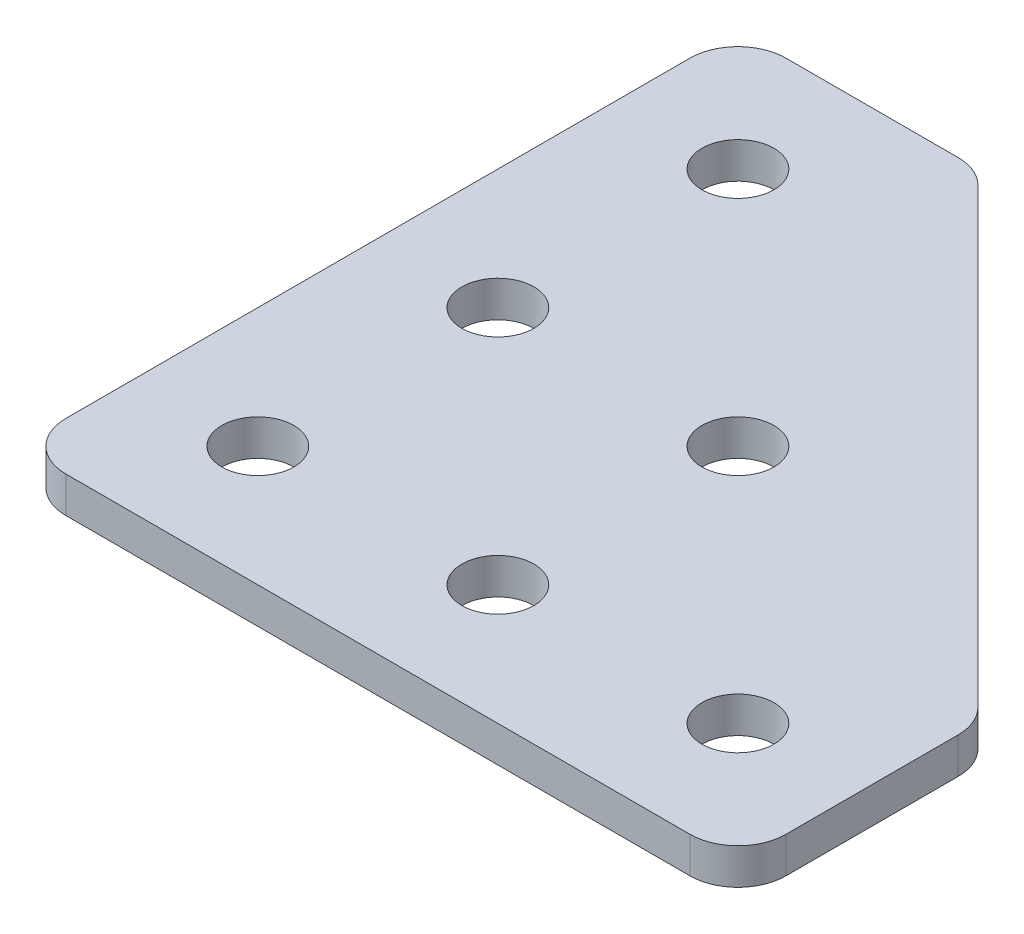
ISO-10303-21;
HEADER;
FILE_DESCRIPTION(('STEP AP214'),'2;1');
FILE_NAME('part.step','',(''),(''),'','','');
FILE_SCHEMA(('AUTOMOTIVE_DESIGN { 1 0 10303 214 1 1 1 1 }'));
ENDSEC;
DATA;
#1=APPLICATION_CONTEXT('core data for automotive mechanical design processes');
#2=APPLICATION_PROTOCOL_DEFINITION('international standard','automotive_design',2000,#1);
#3=PRODUCT_CONTEXT('',#1,'mechanical');
#4=PRODUCT('Part','Part','',(#3));
#5=PRODUCT_RELATED_PRODUCT_CATEGORY('part','',(#4));
#6=PRODUCT_DEFINITION_FORMATION('','',#4);
#7=PRODUCT_DEFINITION_CONTEXT('part definition',#1,'design');
#8=PRODUCT_DEFINITION('design','',#6,#7);
#9=PRODUCT_DEFINITION_SHAPE('','',#8);
#10=(LENGTH_UNIT() NAMED_UNIT(*) SI_UNIT(.MILLI.,.METRE.));
#11=(NAMED_UNIT(*) PLANE_ANGLE_UNIT() SI_UNIT($,.RADIAN.));
#12=(NAMED_UNIT(*) SI_UNIT($,.STERADIAN.) SOLID_ANGLE_UNIT());
#13=UNCERTAINTY_MEASURE_WITH_UNIT(LENGTH_MEASURE(1.E-05),#10,'distance_accuracy_value','');
#14=(GEOMETRIC_REPRESENTATION_CONTEXT(3) GLOBAL_UNCERTAINTY_ASSIGNED_CONTEXT((#13)) GLOBAL_UNIT_ASSIGNED_CONTEXT((#10,
#11,#12)) REPRESENTATION_CONTEXT('',''));
#15=CARTESIAN_POINT('',(0.,0.,0.));
#16=DIRECTION('',(0.,0.,1.));
#17=DIRECTION('',(1.,0.,0.));
#18=AXIS2_PLACEMENT_3D('',#15,#16,#17);
#19=CARTESIAN_POINT('',(0.,1.5,0.));
#20=DIRECTION('',(0.,1.,0.));
#21=DIRECTION('',(0.,0.,1.));
#22=AXIS2_PLACEMENT_3D('',#19,#20,#21);
#23=PLANE('',#22);
#24=CARTESIAN_POINT('',(15.,1.5,-15.));
#25=DIRECTION('',(0.,1.,0.));
#26=DIRECTION('',(0.,0.,1.));
#27=AXIS2_PLACEMENT_3D('',#24,#25,#26);
#28=CIRCLE('',#27,1.5);
#29=CARTESIAN_POINT('',(15.,1.5,-13.5));
#30=VERTEX_POINT('',#29);
#31=EDGE_CURVE('E228',#30,#30,#28,.T.);
#32=ORIENTED_EDGE('',*,*,#31,.F.);
#33=EDGE_LOOP('',(#32));
#34=FACE_BOUND('',#33,.T.);
#35=CARTESIAN_POINT('',(5.,1.5,-25.));
#36=DIRECTION('',(0.,1.,0.));
#37=DIRECTION('',(0.,0.,-1.));
#38=AXIS2_PLACEMENT_3D('',#35,#36,#37);
#39=CIRCLE('',#38,1.5);
#40=CARTESIAN_POINT('',(5.,1.5,-26.5));
#41=VERTEX_POINT('',#40);
#42=EDGE_CURVE('E216',#41,#41,#39,.T.);
#43=ORIENTED_EDGE('',*,*,#42,.F.);
#44=EDGE_LOOP('',(#43));
#45=FACE_BOUND('',#44,.T.);
#46=CARTESIAN_POINT('',(5.,1.5,-5.));
#47=DIRECTION('',(0.,1.,0.));
#48=DIRECTION('',(0.,0.,1.));
#49=AXIS2_PLACEMENT_3D('',#46,#47,#48);
#50=CIRCLE('',#49,1.5);
#51=CARTESIAN_POINT('',(5.,1.5,-3.5));
#52=VERTEX_POINT('',#51);
#53=EDGE_CURVE('E146',#52,#52,#50,.T.);
#54=ORIENTED_EDGE('',*,*,#53,.F.);
#55=EDGE_LOOP('',(#54));
#56=FACE_BOUND('',#55,.T.);
#57=DIRECTION('',(0.,0.,1.));
#58=VECTOR('',#57,1.);
#59=CARTESIAN_POINT('',(0.,1.5,-30.));
#60=LINE('',#59,#58);
#61=CARTESIAN_POINT('',(0.,1.5,-28.));
#62=VERTEX_POINT('',#61);
#63=CARTESIAN_POINT('',(0.,1.5,-2.00000000000001));
#64=VERTEX_POINT('',#63);
#65=EDGE_CURVE('E154',#62,#64,#60,.T.);
#66=ORIENTED_EDGE('',*,*,#65,.T.);
#67=CARTESIAN_POINT('',(2.,1.5,-2.));
#68=DIRECTION('',(0.,1.,0.));
#69=DIRECTION('',(0.,0.,1.));
#70=AXIS2_PLACEMENT_3D('',#67,#68,#69);
#71=CIRCLE('',#70,2.);
#72=CARTESIAN_POINT('',(2.,1.5,0.));
#73=VERTEX_POINT('',#72);
#74=EDGE_CURVE('E173',#64,#73,#71,.T.);
#75=ORIENTED_EDGE('',*,*,#74,.T.);
#76=DIRECTION('',(1.,0.,0.));
#77=VECTOR('',#76,1.);
#78=CARTESIAN_POINT('',(0.,1.5,0.));
#79=LINE('',#78,#77);
#80=CARTESIAN_POINT('',(28.,1.5,0.));
#81=VERTEX_POINT('',#80);
#82=EDGE_CURVE('E133',#73,#81,#79,.T.);
#83=ORIENTED_EDGE('',*,*,#82,.T.);
#84=CARTESIAN_POINT('',(28.,1.5,-2.));
#85=DIRECTION('',(0.,1.,0.));
#86=DIRECTION('',(0.,0.,1.));
#87=AXIS2_PLACEMENT_3D('',#84,#85,#86);
#88=CIRCLE('',#87,2.);
#89=CARTESIAN_POINT('',(30.,1.5,-2.));
#90=VERTEX_POINT('',#89);
#91=EDGE_CURVE('E171',#81,#90,#88,.T.);
#92=ORIENTED_EDGE('',*,*,#91,.T.);
#93=DIRECTION('',(0.,0.,-1.));
#94=VECTOR('',#93,1.);
#95=CARTESIAN_POINT('',(30.,1.5,0.));
#96=LINE('',#95,#94);
#97=CARTESIAN_POINT('',(30.,1.5,-9.17157287525381));
#98=VERTEX_POINT('',#97);
#99=EDGE_CURVE('E199',#90,#98,#96,.T.);
#100=ORIENTED_EDGE('',*,*,#99,.T.);
#101=CARTESIAN_POINT('',(28.,1.5,-9.17157287525381));
#102=DIRECTION('',(0.,1.,0.));
#103=DIRECTION('',(0.,0.,1.));
#104=AXIS2_PLACEMENT_3D('',#101,#102,#103);
#105=CIRCLE('',#104,2.);
#106=CARTESIAN_POINT('',(29.4142135623731,1.5,-10.5857864376269));
#107=VERTEX_POINT('',#106);
#108=EDGE_CURVE('E169',#98,#107,#105,.T.);
#109=ORIENTED_EDGE('',*,*,#108,.T.);
#110=DIRECTION('',(-0.707106781186548,0.,-0.707106781186548));
#111=VECTOR('',#110,1.);
#112=CARTESIAN_POINT('',(30.,1.5,-10.));
#113=LINE('',#112,#111);
#114=CARTESIAN_POINT('',(10.5857864376269,1.5,-29.4142135623731));
#115=VERTEX_POINT('',#114);
#116=EDGE_CURVE('E190',#107,#115,#113,.T.);
#117=ORIENTED_EDGE('',*,*,#116,.T.);
#118=CARTESIAN_POINT('',(9.17157287525381,1.5,-28.));
#119=DIRECTION('',(0.,1.,0.));
#120=DIRECTION('',(0.,0.,1.));
#121=AXIS2_PLACEMENT_3D('',#118,#119,#120);
#122=CIRCLE('',#121,2.);
#123=CARTESIAN_POINT('',(9.17157287525381,1.5,-30.));
#124=VERTEX_POINT('',#123);
#125=EDGE_CURVE('E56',#115,#124,#122,.T.);
#126=ORIENTED_EDGE('',*,*,#125,.T.);
#127=DIRECTION('',(-1.,0.,0.));
#128=VECTOR('',#127,1.);
#129=CARTESIAN_POINT('',(10.,1.5,-30.));
#130=LINE('',#129,#128);
#131=CARTESIAN_POINT('',(2.,1.5,-30.));
#132=VERTEX_POINT('',#131);
#133=EDGE_CURVE('E155',#124,#132,#130,.T.);
#134=ORIENTED_EDGE('',*,*,#133,.T.);
#135=CARTESIAN_POINT('',(2.,1.5,-28.));
#136=DIRECTION('',(0.,1.,0.));
#137=DIRECTION('',(0.,0.,1.));
#138=AXIS2_PLACEMENT_3D('',#135,#136,#137);
#139=CIRCLE('',#138,2.);
#140=EDGE_CURVE('E166',#132,#62,#139,.T.);
#141=ORIENTED_EDGE('',*,*,#140,.T.);
#142=EDGE_LOOP('',(#66,#75,#83,#92,#100,#109,#117,#126,#134,#141));
#143=FACE_BOUND('',#142,.T.);
#144=CARTESIAN_POINT('',(25.,1.5,-5.));
#145=DIRECTION('',(0.,1.,0.));
#146=DIRECTION('',(0.,0.,1.));
#147=AXIS2_PLACEMENT_3D('',#144,#145,#146);
#148=CIRCLE('',#147,1.5);
#149=CARTESIAN_POINT('',(25.,1.5,-3.5));
#150=VERTEX_POINT('',#149);
#151=EDGE_CURVE('E210',#150,#150,#148,.T.);
#152=ORIENTED_EDGE('',*,*,#151,.F.);
#153=EDGE_LOOP('',(#152));
#154=FACE_BOUND('',#153,.T.);
#155=CARTESIAN_POINT('',(5.,1.5,-15.));
#156=DIRECTION('',(0.,1.,0.));
#157=DIRECTION('',(0.,0.,1.));
#158=AXIS2_PLACEMENT_3D('',#155,#156,#157);
#159=CIRCLE('',#158,1.5);
#160=CARTESIAN_POINT('',(5.,1.5,-13.5));
#161=VERTEX_POINT('',#160);
#162=EDGE_CURVE('E222',#161,#161,#159,.T.);
#163=ORIENTED_EDGE('',*,*,#162,.F.);
#164=EDGE_LOOP('',(#163));
#165=FACE_BOUND('',#164,.T.);
#166=CARTESIAN_POINT('',(15.,1.5,-5.));
#167=DIRECTION('',(0.,1.,0.));
#168=DIRECTION('',(0.,0.,1.));
#169=AXIS2_PLACEMENT_3D('',#166,#167,#168);
#170=CIRCLE('',#169,1.5);
#171=CARTESIAN_POINT('',(15.,1.5,-3.5));
#172=VERTEX_POINT('',#171);
#173=EDGE_CURVE('E234',#172,#172,#170,.T.);
#174=ORIENTED_EDGE('',*,*,#173,.F.);
#175=EDGE_LOOP('',(#174));
#176=FACE_BOUND('',#175,.T.);
#177=ADVANCED_FACE('F35',(#34,#45,#56,#143,#154,#165,#176),#23,.T.);
#178=CARTESIAN_POINT('',(0.,0.,0.));
#179=DIRECTION('',(0.,1.,0.));
#180=DIRECTION('',(0.,0.,1.));
#181=AXIS2_PLACEMENT_3D('',#178,#179,#180);
#182=PLANE('',#181);
#183=DIRECTION('',(1.,0.,0.));
#184=VECTOR('',#183,1.);
#185=CARTESIAN_POINT('',(0.,0.,0.));
#186=LINE('',#185,#184);
#187=CARTESIAN_POINT('',(2.,0.,0.));
#188=VERTEX_POINT('',#187);
#189=CARTESIAN_POINT('',(28.,0.,0.));
#190=VERTEX_POINT('',#189);
#191=EDGE_CURVE('E130',#188,#190,#186,.T.);
#192=ORIENTED_EDGE('',*,*,#191,.F.);
#193=CARTESIAN_POINT('',(2.,0.,-2.));
#194=DIRECTION('',(0.,1.,0.));
#195=DIRECTION('',(0.,0.,1.));
#196=AXIS2_PLACEMENT_3D('',#193,#194,#195);
#197=CIRCLE('',#196,2.);
#198=CARTESIAN_POINT('',(0.,0.,-2.00000000000001));
#199=VERTEX_POINT('',#198);
#200=EDGE_CURVE('E113',#188,#199,#197,.F.);
#201=ORIENTED_EDGE('',*,*,#200,.T.);
#202=DIRECTION('',(0.,0.,1.));
#203=VECTOR('',#202,1.);
#204=CARTESIAN_POINT('',(0.,0.,-30.));
#205=LINE('',#204,#203);
#206=CARTESIAN_POINT('',(0.,0.,-28.));
#207=VERTEX_POINT('',#206);
#208=EDGE_CURVE('E141',#207,#199,#205,.T.);
#209=ORIENTED_EDGE('',*,*,#208,.F.);
#210=CARTESIAN_POINT('',(2.,0.,-28.));
#211=DIRECTION('',(0.,1.,0.));
#212=DIRECTION('',(0.,0.,1.));
#213=AXIS2_PLACEMENT_3D('',#210,#211,#212);
#214=CIRCLE('',#213,2.);
#215=CARTESIAN_POINT('',(2.,0.,-30.));
#216=VERTEX_POINT('',#215);
#217=EDGE_CURVE('E134',#207,#216,#214,.F.);
#218=ORIENTED_EDGE('',*,*,#217,.T.);
#219=DIRECTION('',(-1.,0.,0.));
#220=VECTOR('',#219,1.);
#221=CARTESIAN_POINT('',(10.,0.,-30.));
#222=LINE('',#221,#220);
#223=CARTESIAN_POINT('',(9.17157287525381,0.,-30.));
#224=VERTEX_POINT('',#223);
#225=EDGE_CURVE('E152',#224,#216,#222,.T.);
#226=ORIENTED_EDGE('',*,*,#225,.F.);
#227=CARTESIAN_POINT('',(9.17157287525381,0.,-28.));
#228=DIRECTION('',(0.,1.,0.));
#229=DIRECTION('',(0.,0.,1.));
#230=AXIS2_PLACEMENT_3D('',#227,#228,#229);
#231=CIRCLE('',#230,2.);
#232=CARTESIAN_POINT('',(10.5857864376269,0.,-29.4142135623731));
#233=VERTEX_POINT('',#232);
#234=EDGE_CURVE('E158',#224,#233,#231,.F.);
#235=ORIENTED_EDGE('',*,*,#234,.T.);
#236=DIRECTION('',(-0.707106781186548,0.,-0.707106781186548));
#237=VECTOR('',#236,1.);
#238=CARTESIAN_POINT('',(30.,0.,-10.));
#239=LINE('',#238,#237);
#240=CARTESIAN_POINT('',(29.4142135623731,0.,-10.5857864376269));
#241=VERTEX_POINT('',#240);
#242=EDGE_CURVE('E144',#241,#233,#239,.T.);
#243=ORIENTED_EDGE('',*,*,#242,.F.);
#244=CARTESIAN_POINT('',(28.,0.,-9.17157287525381));
#245=DIRECTION('',(0.,1.,0.));
#246=DIRECTION('',(0.,0.,1.));
#247=AXIS2_PLACEMENT_3D('',#244,#245,#246);
#248=CIRCLE('',#247,2.);
#249=CARTESIAN_POINT('',(30.,0.,-9.17157287525381));
#250=VERTEX_POINT('',#249);
#251=EDGE_CURVE('E160',#241,#250,#248,.F.);
#252=ORIENTED_EDGE('',*,*,#251,.T.);
#253=DIRECTION('',(0.,0.,-1.));
#254=VECTOR('',#253,1.);
#255=CARTESIAN_POINT('',(30.,0.,0.));
#256=LINE('',#255,#254);
#257=CARTESIAN_POINT('',(30.,0.,-2.));
#258=VERTEX_POINT('',#257);
#259=EDGE_CURVE('E140',#258,#250,#256,.T.);
#260=ORIENTED_EDGE('',*,*,#259,.F.);
#261=CARTESIAN_POINT('',(28.,0.,-2.));
#262=DIRECTION('',(0.,1.,0.));
#263=DIRECTION('',(0.,0.,1.));
#264=AXIS2_PLACEMENT_3D('',#261,#262,#263);
#265=CIRCLE('',#264,2.);
#266=EDGE_CURVE('E124',#258,#190,#265,.F.);
#267=ORIENTED_EDGE('',*,*,#266,.T.);
#268=EDGE_LOOP('',(#192,#201,#209,#218,#226,#235,#243,#252,#260,#267));
#269=FACE_BOUND('',#268,.T.);
#270=CARTESIAN_POINT('',(5.,0.,-5.));
#271=DIRECTION('',(0.,1.,0.));
#272=DIRECTION('',(0.,0.,1.));
#273=AXIS2_PLACEMENT_3D('',#270,#271,#272);
#274=CIRCLE('',#273,1.5);
#275=CARTESIAN_POINT('',(5.,0.,-3.5));
#276=VERTEX_POINT('',#275);
#277=EDGE_CURVE('E207',#276,#276,#274,.T.);
#278=ORIENTED_EDGE('',*,*,#277,.T.);
#279=EDGE_LOOP('',(#278));
#280=FACE_BOUND('',#279,.T.);
#281=CARTESIAN_POINT('',(25.,0.,-5.));
#282=DIRECTION('',(0.,1.,0.));
#283=DIRECTION('',(0.,0.,1.));
#284=AXIS2_PLACEMENT_3D('',#281,#282,#283);
#285=CIRCLE('',#284,1.5);
#286=CARTESIAN_POINT('',(25.,0.,-3.5));
#287=VERTEX_POINT('',#286);
#288=EDGE_CURVE('E213',#287,#287,#285,.T.);
#289=ORIENTED_EDGE('',*,*,#288,.T.);
#290=EDGE_LOOP('',(#289));
#291=FACE_BOUND('',#290,.T.);
#292=CARTESIAN_POINT('',(5.,0.,-25.));
#293=DIRECTION('',(0.,1.,0.));
#294=DIRECTION('',(0.,0.,-1.));
#295=AXIS2_PLACEMENT_3D('',#292,#293,#294);
#296=CIRCLE('',#295,1.5);
#297=CARTESIAN_POINT('',(5.,0.,-26.5));
#298=VERTEX_POINT('',#297);
#299=EDGE_CURVE('E219',#298,#298,#296,.T.);
#300=ORIENTED_EDGE('',*,*,#299,.T.);
#301=EDGE_LOOP('',(#300));
#302=FACE_BOUND('',#301,.T.);
#303=CARTESIAN_POINT('',(5.,0.,-15.));
#304=DIRECTION('',(0.,1.,0.));
#305=DIRECTION('',(0.,0.,1.));
#306=AXIS2_PLACEMENT_3D('',#303,#304,#305);
#307=CIRCLE('',#306,1.5);
#308=CARTESIAN_POINT('',(5.,0.,-13.5));
#309=VERTEX_POINT('',#308);
#310=EDGE_CURVE('E225',#309,#309,#307,.T.);
#311=ORIENTED_EDGE('',*,*,#310,.T.);
#312=EDGE_LOOP('',(#311));
#313=FACE_BOUND('',#312,.T.);
#314=CARTESIAN_POINT('',(15.,0.,-15.));
#315=DIRECTION('',(0.,1.,0.));
#316=DIRECTION('',(0.,0.,1.));
#317=AXIS2_PLACEMENT_3D('',#314,#315,#316);
#318=CIRCLE('',#317,1.5);
#319=CARTESIAN_POINT('',(15.,0.,-13.5));
#320=VERTEX_POINT('',#319);
#321=EDGE_CURVE('E231',#320,#320,#318,.T.);
#322=ORIENTED_EDGE('',*,*,#321,.T.);
#323=EDGE_LOOP('',(#322));
#324=FACE_BOUND('',#323,.T.);
#325=CARTESIAN_POINT('',(15.,0.,-5.));
#326=DIRECTION('',(0.,1.,0.));
#327=DIRECTION('',(0.,0.,1.));
#328=AXIS2_PLACEMENT_3D('',#325,#326,#327);
#329=CIRCLE('',#328,1.5);
#330=CARTESIAN_POINT('',(15.,0.,-3.5));
#331=VERTEX_POINT('',#330);
#332=EDGE_CURVE('E237',#331,#331,#329,.T.);
#333=ORIENTED_EDGE('',*,*,#332,.T.);
#334=EDGE_LOOP('',(#333));
#335=FACE_BOUND('',#334,.T.);
#336=ADVANCED_FACE('F137',(#269,#280,#291,#302,#313,#324,#335),#182,.F.);
#337=CARTESIAN_POINT('',(0.,1.5,-30.));
#338=DIRECTION('',(1.,0.,0.));
#339=DIRECTION('',(0.,0.,-1.));
#340=AXIS2_PLACEMENT_3D('',#337,#338,#339);
#341=PLANE('',#340);
#342=ORIENTED_EDGE('',*,*,#208,.T.);
#343=DIRECTION('',(0.,-1.,0.));
#344=VECTOR('',#343,1.);
#345=CARTESIAN_POINT('',(0.,1.5,-2.));
#346=LINE('',#345,#344);
#347=EDGE_CURVE('E118',#199,#64,#346,.F.);
#348=ORIENTED_EDGE('',*,*,#347,.T.);
#349=ORIENTED_EDGE('',*,*,#65,.F.);
#350=DIRECTION('',(0.,-1.,0.));
#351=VECTOR('',#350,1.);
#352=CARTESIAN_POINT('',(0.,1.5,-28.));
#353=LINE('',#352,#351);
#354=EDGE_CURVE('E123',#62,#207,#353,.T.);
#355=ORIENTED_EDGE('',*,*,#354,.T.);
#356=EDGE_LOOP('',(#342,#348,#349,#355));
#357=FACE_BOUND('',#356,.T.);
#358=ADVANCED_FACE('F252',(#357),#341,.F.);
#359=CARTESIAN_POINT('',(0.,1.5,0.));
#360=DIRECTION('',(0.,0.,-1.));
#361=DIRECTION('',(-1.,0.,0.));
#362=AXIS2_PLACEMENT_3D('',#359,#360,#361);
#363=PLANE('',#362);
#364=ORIENTED_EDGE('',*,*,#82,.F.);
#365=DIRECTION('',(0.,-1.,0.));
#366=VECTOR('',#365,1.);
#367=CARTESIAN_POINT('',(2.,1.5,0.));
#368=LINE('',#367,#366);
#369=EDGE_CURVE('E117',#73,#188,#368,.T.);
#370=ORIENTED_EDGE('',*,*,#369,.T.);
#371=ORIENTED_EDGE('',*,*,#191,.T.);
#372=DIRECTION('',(0.,-1.,0.));
#373=VECTOR('',#372,1.);
#374=CARTESIAN_POINT('',(28.,1.5,0.));
#375=LINE('',#374,#373);
#376=EDGE_CURVE('E135',#190,#81,#375,.F.);
#377=ORIENTED_EDGE('',*,*,#376,.T.);
#378=EDGE_LOOP('',(#364,#370,#371,#377));
#379=FACE_BOUND('',#378,.T.);
#380=ADVANCED_FACE('F129',(#379),#363,.F.);
#381=CARTESIAN_POINT('',(30.,1.5,0.));
#382=DIRECTION('',(-1.,0.,0.));
#383=DIRECTION('',(0.,0.,1.));
#384=AXIS2_PLACEMENT_3D('',#381,#382,#383);
#385=PLANE('',#384);
#386=ORIENTED_EDGE('',*,*,#99,.F.);
#387=DIRECTION('',(0.,-1.,0.));
#388=VECTOR('',#387,1.);
#389=CARTESIAN_POINT('',(30.,1.5,-2.));
#390=LINE('',#389,#388);
#391=EDGE_CURVE('E177',#90,#258,#390,.T.);
#392=ORIENTED_EDGE('',*,*,#391,.T.);
#393=ORIENTED_EDGE('',*,*,#259,.T.);
#394=DIRECTION('',(0.,-1.,0.));
#395=VECTOR('',#394,1.);
#396=CARTESIAN_POINT('',(30.,1.5,-9.17157287525381));
#397=LINE('',#396,#395);
#398=EDGE_CURVE('E175',#250,#98,#397,.F.);
#399=ORIENTED_EDGE('',*,*,#398,.T.);
#400=EDGE_LOOP('',(#386,#392,#393,#399));
#401=FACE_BOUND('',#400,.T.);
#402=ADVANCED_FACE('F264',(#401),#385,.F.);
#403=CARTESIAN_POINT('',(30.,1.5,-10.));
#404=DIRECTION('',(-0.707106781186547,0.,0.707106781186547));
#405=DIRECTION('',(0.707106781186548,0.,0.707106781186548));
#406=AXIS2_PLACEMENT_3D('',#403,#404,#405);
#407=PLANE('',#406);
#408=ORIENTED_EDGE('',*,*,#116,.F.);
#409=DIRECTION('',(0.,-1.,0.));
#410=VECTOR('',#409,1.);
#411=CARTESIAN_POINT('',(29.4142135623731,1.5,-10.5857864376269));
#412=LINE('',#411,#410);
#413=EDGE_CURVE('E182',#107,#241,#412,.T.);
#414=ORIENTED_EDGE('',*,*,#413,.T.);
#415=ORIENTED_EDGE('',*,*,#242,.T.);
#416=DIRECTION('',(0.,-1.,0.));
#417=VECTOR('',#416,1.);
#418=CARTESIAN_POINT('',(10.5857864376269,1.5,-29.4142135623731));
#419=LINE('',#418,#417);
#420=EDGE_CURVE('E180',#233,#115,#419,.F.);
#421=ORIENTED_EDGE('',*,*,#420,.T.);
#422=EDGE_LOOP('',(#408,#414,#415,#421));
#423=FACE_BOUND('',#422,.T.);
#424=ADVANCED_FACE('F188',(#423),#407,.F.);
#425=CARTESIAN_POINT('',(10.,1.5,-30.));
#426=DIRECTION('',(0.,0.,1.));
#427=DIRECTION('',(1.,0.,0.));
#428=AXIS2_PLACEMENT_3D('',#425,#426,#427);
#429=PLANE('',#428);
#430=ORIENTED_EDGE('',*,*,#133,.F.);
#431=DIRECTION('',(0.,-1.,0.));
#432=VECTOR('',#431,1.);
#433=CARTESIAN_POINT('',(9.17157287525381,1.5,-30.));
#434=LINE('',#433,#432);
#435=EDGE_CURVE('E11',#124,#224,#434,.T.);
#436=ORIENTED_EDGE('',*,*,#435,.T.);
#437=ORIENTED_EDGE('',*,*,#225,.T.);
#438=DIRECTION('',(0.,-1.,0.));
#439=VECTOR('',#438,1.);
#440=CARTESIAN_POINT('',(2.,1.5,-30.));
#441=LINE('',#440,#439);
#442=EDGE_CURVE('E43',#216,#132,#441,.F.);
#443=ORIENTED_EDGE('',*,*,#442,.T.);
#444=EDGE_LOOP('',(#430,#436,#437,#443));
#445=FACE_BOUND('',#444,.T.);
#446=ADVANCED_FACE('F197',(#445),#429,.F.);
#447=CARTESIAN_POINT('',(5.,1.5,-5.));
#448=DIRECTION('',(0.,-1.,0.));
#449=DIRECTION('',(0.,0.,-1.));
#450=AXIS2_PLACEMENT_3D('',#447,#448,#449);
#451=CYLINDRICAL_SURFACE('',#450,1.5);
#452=ORIENTED_EDGE('',*,*,#53,.T.);
#453=EDGE_LOOP('',(#452));
#454=FACE_BOUND('',#453,.T.);
#455=ORIENTED_EDGE('',*,*,#277,.F.);
#456=EDGE_LOOP('',(#455));
#457=FACE_BOUND('',#456,.T.);
#458=ADVANCED_FACE('F257',(#454,#457),#451,.F.);
#459=CARTESIAN_POINT('',(25.,1.5,-5.));
#460=DIRECTION('',(0.,-1.,0.));
#461=DIRECTION('',(0.,0.,-1.));
#462=AXIS2_PLACEMENT_3D('',#459,#460,#461);
#463=CYLINDRICAL_SURFACE('',#462,1.5);
#464=ORIENTED_EDGE('',*,*,#151,.T.);
#465=EDGE_LOOP('',(#464));
#466=FACE_BOUND('',#465,.T.);
#467=ORIENTED_EDGE('',*,*,#288,.F.);
#468=EDGE_LOOP('',(#467));
#469=FACE_BOUND('',#468,.T.);
#470=ADVANCED_FACE('F320',(#466,#469),#463,.F.);
#471=CARTESIAN_POINT('',(5.,1.5,-25.));
#472=DIRECTION('',(0.,-1.,0.));
#473=DIRECTION('',(0.,0.,-1.));
#474=AXIS2_PLACEMENT_3D('',#471,#472,#473);
#475=CYLINDRICAL_SURFACE('',#474,1.5);
#476=ORIENTED_EDGE('',*,*,#42,.T.);
#477=EDGE_LOOP('',(#476));
#478=FACE_BOUND('',#477,.T.);
#479=ORIENTED_EDGE('',*,*,#299,.F.);
#480=EDGE_LOOP('',(#479));
#481=FACE_BOUND('',#480,.T.);
#482=ADVANCED_FACE('F303',(#478,#481),#475,.F.);
#483=CARTESIAN_POINT('',(5.,1.5,-15.));
#484=DIRECTION('',(0.,-1.,0.));
#485=DIRECTION('',(0.,0.,-1.));
#486=AXIS2_PLACEMENT_3D('',#483,#484,#485);
#487=CYLINDRICAL_SURFACE('',#486,1.5);
#488=ORIENTED_EDGE('',*,*,#162,.T.);
#489=EDGE_LOOP('',(#488));
#490=FACE_BOUND('',#489,.T.);
#491=ORIENTED_EDGE('',*,*,#310,.F.);
#492=EDGE_LOOP('',(#491));
#493=FACE_BOUND('',#492,.T.);
#494=ADVANCED_FACE('F299',(#490,#493),#487,.F.);
#495=CARTESIAN_POINT('',(15.,1.5,-15.));
#496=DIRECTION('',(0.,-1.,0.));
#497=DIRECTION('',(0.,0.,-1.));
#498=AXIS2_PLACEMENT_3D('',#495,#496,#497);
#499=CYLINDRICAL_SURFACE('',#498,1.5);
#500=ORIENTED_EDGE('',*,*,#31,.T.);
#501=EDGE_LOOP('',(#500));
#502=FACE_BOUND('',#501,.T.);
#503=ORIENTED_EDGE('',*,*,#321,.F.);
#504=EDGE_LOOP('',(#503));
#505=FACE_BOUND('',#504,.T.);
#506=ADVANCED_FACE('F302',(#502,#505),#499,.F.);
#507=CARTESIAN_POINT('',(15.,1.5,-5.));
#508=DIRECTION('',(0.,-1.,0.));
#509=DIRECTION('',(0.,0.,-1.));
#510=AXIS2_PLACEMENT_3D('',#507,#508,#509);
#511=CYLINDRICAL_SURFACE('',#510,1.5);
#512=ORIENTED_EDGE('',*,*,#173,.T.);
#513=EDGE_LOOP('',(#512));
#514=FACE_BOUND('',#513,.T.);
#515=ORIENTED_EDGE('',*,*,#332,.F.);
#516=EDGE_LOOP('',(#515));
#517=FACE_BOUND('',#516,.T.);
#518=ADVANCED_FACE('F243',(#514,#517),#511,.F.);
#519=CARTESIAN_POINT('',(2.,1.5,-2.));
#520=DIRECTION('',(0.,-1.,0.));
#521=DIRECTION('',(0.,0.,-1.));
#522=AXIS2_PLACEMENT_3D('',#519,#520,#521);
#523=CYLINDRICAL_SURFACE('',#522,2.);
#524=ORIENTED_EDGE('',*,*,#74,.F.);
#525=ORIENTED_EDGE('',*,*,#347,.F.);
#526=ORIENTED_EDGE('',*,*,#200,.F.);
#527=ORIENTED_EDGE('',*,*,#369,.F.);
#528=EDGE_LOOP('',(#524,#525,#526,#527));
#529=FACE_BOUND('',#528,.T.);
#530=ADVANCED_FACE('F116',(#529),#523,.T.);
#531=CARTESIAN_POINT('',(28.,1.5,-2.));
#532=DIRECTION('',(0.,-1.,0.));
#533=DIRECTION('',(0.,0.,-1.));
#534=AXIS2_PLACEMENT_3D('',#531,#532,#533);
#535=CYLINDRICAL_SURFACE('',#534,2.);
#536=ORIENTED_EDGE('',*,*,#91,.F.);
#537=ORIENTED_EDGE('',*,*,#376,.F.);
#538=ORIENTED_EDGE('',*,*,#266,.F.);
#539=ORIENTED_EDGE('',*,*,#391,.F.);
#540=EDGE_LOOP('',(#536,#537,#538,#539));
#541=FACE_BOUND('',#540,.T.);
#542=ADVANCED_FACE('F275',(#541),#535,.T.);
#543=CARTESIAN_POINT('',(28.,1.5,-9.17157287525381));
#544=DIRECTION('',(0.,-1.,0.));
#545=DIRECTION('',(0.,0.,-1.));
#546=AXIS2_PLACEMENT_3D('',#543,#544,#545);
#547=CYLINDRICAL_SURFACE('',#546,2.);
#548=ORIENTED_EDGE('',*,*,#108,.F.);
#549=ORIENTED_EDGE('',*,*,#398,.F.);
#550=ORIENTED_EDGE('',*,*,#251,.F.);
#551=ORIENTED_EDGE('',*,*,#413,.F.);
#552=EDGE_LOOP('',(#548,#549,#550,#551));
#553=FACE_BOUND('',#552,.T.);
#554=ADVANCED_FACE('F278',(#553),#547,.T.);
#555=CARTESIAN_POINT('',(9.17157287525381,1.5,-28.));
#556=DIRECTION('',(0.,-1.,0.));
#557=DIRECTION('',(0.,0.,-1.));
#558=AXIS2_PLACEMENT_3D('',#555,#556,#557);
#559=CYLINDRICAL_SURFACE('',#558,2.);
#560=ORIENTED_EDGE('',*,*,#125,.F.);
#561=ORIENTED_EDGE('',*,*,#420,.F.);
#562=ORIENTED_EDGE('',*,*,#234,.F.);
#563=ORIENTED_EDGE('',*,*,#435,.F.);
#564=EDGE_LOOP('',(#560,#561,#562,#563));
#565=FACE_BOUND('',#564,.T.);
#566=ADVANCED_FACE('F196',(#565),#559,.T.);
#567=CARTESIAN_POINT('',(2.,1.5,-28.));
#568=DIRECTION('',(0.,-1.,0.));
#569=DIRECTION('',(0.,0.,-1.));
#570=AXIS2_PLACEMENT_3D('',#567,#568,#569);
#571=CYLINDRICAL_SURFACE('',#570,2.);
#572=ORIENTED_EDGE('',*,*,#140,.F.);
#573=ORIENTED_EDGE('',*,*,#442,.F.);
#574=ORIENTED_EDGE('',*,*,#217,.F.);
#575=ORIENTED_EDGE('',*,*,#354,.F.);
#576=EDGE_LOOP('',(#572,#573,#574,#575));
#577=FACE_BOUND('',#576,.T.);
#578=ADVANCED_FACE('F37',(#577),#571,.T.);
#579=CLOSED_SHELL('',(#177,#336,#358,#380,#402,#424,#446,#458,#470,#482,#494,#506,#518,#530,
#542,#554,#566,#578));
#580=MANIFOLD_SOLID_BREP('B2',#579);
#581=ADVANCED_BREP_SHAPE_REPRESENTATION('',(#18,#580),#14);
#582=SHAPE_DEFINITION_REPRESENTATION(#9,#581);
ENDSEC;
END-ISO-10303-21;
